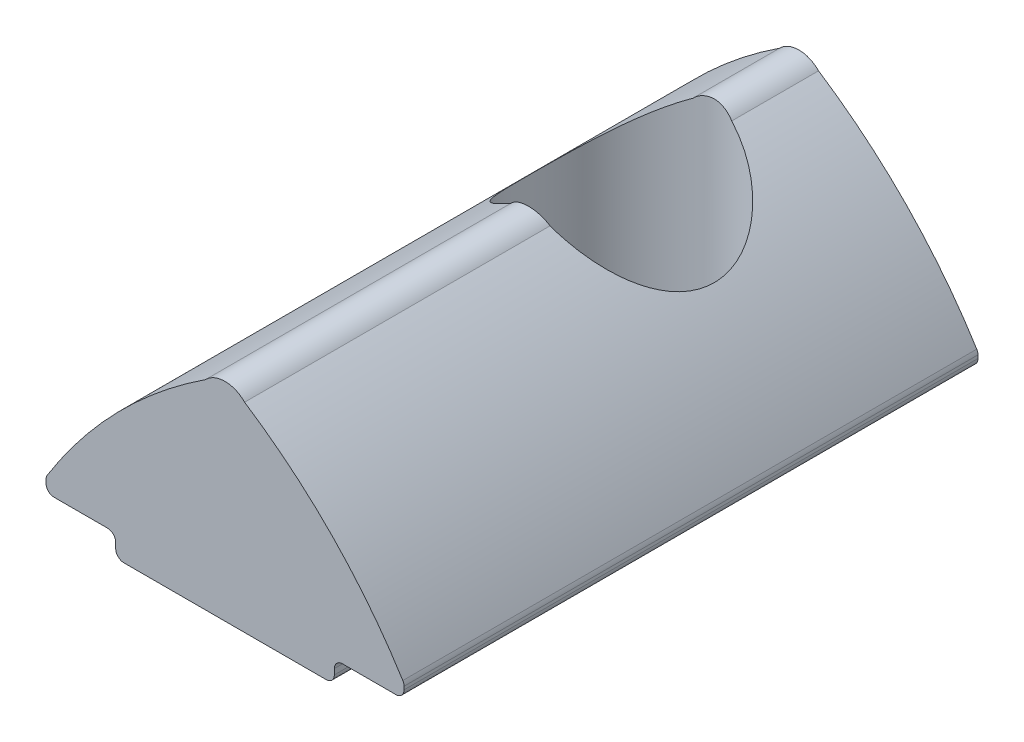
ISO-10303-21;
HEADER;
FILE_DESCRIPTION(('STEP AP214'),'2;1');
FILE_NAME('part.step','',(''),(''),'','','');
FILE_SCHEMA(('AUTOMOTIVE_DESIGN { 1 0 10303 214 1 1 1 1 }'));
ENDSEC;
DATA;
#1=APPLICATION_CONTEXT('core data for automotive mechanical design processes');
#2=APPLICATION_PROTOCOL_DEFINITION('international standard','automotive_design',2000,#1);
#3=PRODUCT_CONTEXT('',#1,'mechanical');
#4=PRODUCT('Part','Part','',(#3));
#5=PRODUCT_RELATED_PRODUCT_CATEGORY('part','',(#4));
#6=PRODUCT_DEFINITION_FORMATION('','',#4);
#7=PRODUCT_DEFINITION_CONTEXT('part definition',#1,'design');
#8=PRODUCT_DEFINITION('design','',#6,#7);
#9=PRODUCT_DEFINITION_SHAPE('','',#8);
#10=(LENGTH_UNIT() NAMED_UNIT(*) SI_UNIT(.MILLI.,.METRE.));
#11=(NAMED_UNIT(*) PLANE_ANGLE_UNIT() SI_UNIT($,.RADIAN.));
#12=(NAMED_UNIT(*) SI_UNIT($,.STERADIAN.) SOLID_ANGLE_UNIT());
#13=UNCERTAINTY_MEASURE_WITH_UNIT(LENGTH_MEASURE(1.E-05),#10,'distance_accuracy_value','');
#14=(GEOMETRIC_REPRESENTATION_CONTEXT(3) GLOBAL_UNCERTAINTY_ASSIGNED_CONTEXT((#13)) GLOBAL_UNIT_ASSIGNED_CONTEXT((#10,
#11,#12)) REPRESENTATION_CONTEXT('',''));
#15=CARTESIAN_POINT('',(0.,0.,0.));
#16=DIRECTION('',(0.,0.,1.));
#17=DIRECTION('',(1.,0.,0.));
#18=AXIS2_PLACEMENT_3D('',#15,#16,#17);
#19=CARTESIAN_POINT('',(-1.52655665885959E-13,6.59999999999986,10.5));
#20=DIRECTION('',(0.,0.,-1.));
#21=DIRECTION('',(-1.,0.,0.));
#22=AXIS2_PLACEMENT_3D('',#19,#20,#21);
#23=CYLINDRICAL_SURFACE('',#22,1.);
#24=DIRECTION('',(0.,0.,-1.));
#25=VECTOR('',#24,1.);
#26=CARTESIAN_POINT('',(0.716844819182674,7.29723274823443,10.5));
#27=LINE('',#26,#25);
#28=CARTESIAN_POINT('',(0.716844819182674,7.29723274823443,10.5));
#29=VERTEX_POINT('',#28);
#30=CARTESIAN_POINT('',(0.716844819182673,7.29723274823443,-0.676427598921525));
#31=VERTEX_POINT('',#30);
#32=EDGE_CURVE('E266',#29,#31,#27,.T.);
#33=ORIENTED_EDGE('',*,*,#32,.T.);
#34=CARTESIAN_POINT('',(0.716844819182678,7.29723274823444,-0.676427598921526));
#35=CARTESIAN_POINT('',(0.677925214604644,7.33729878800622,-0.668010463923414));
#36=CARTESIAN_POINT('',(0.63559102108074,7.37406183399302,-0.659615536711152));
#37=CARTESIAN_POINT('',(0.545253242979838,7.44012737215521,-0.643698211765947));
#38=CARTESIAN_POINT('',(0.497244743670531,7.46942332645217,-0.636176581771589));
#39=CARTESIAN_POINT('',(0.396725431604346,7.51965949452753,-0.622842974135057));
#40=CARTESIAN_POINT('',(0.344208888964102,7.54058887720242,-0.617033215168026));
#41=CARTESIAN_POINT('',(0.23624443626896,7.57332698927504,-0.607786052545363));
#42=CARTESIAN_POINT('',(0.180799011557425,7.58514332294269,-0.604346671213226));
#43=CARTESIAN_POINT('',(0.0701030157997564,7.59905686909638,-0.600283555889892));
#44=CARTESIAN_POINT('',(0.0148865582247654,7.60140446584473,-0.599587296575949));
#45=CARTESIAN_POINT('',(-0.0951534145605969,7.59698419297526,-0.600886452890884));
#46=CARTESIAN_POINT('',(-0.149976902734196,7.59021570209789,-0.602882051969392));
#47=CARTESIAN_POINT('',(-0.25660173105524,7.56802197984294,-0.609283631183055));
#48=CARTESIAN_POINT('',(-0.308440530318739,7.55276206895182,-0.613643540205256));
#49=CARTESIAN_POINT('',(-0.408830200514077,7.51419339352829,-0.624291486484262));
#50=CARTESIAN_POINT('',(-0.457380509340819,7.49088325709448,-0.630579852363889));
#51=CARTESIAN_POINT('',(-0.542858207527721,7.44104911351975,-0.643383161510443));
#52=CARTESIAN_POINT('',(-0.580426259307904,7.41556609575048,-0.649715485526811));
#53=CARTESIAN_POINT('',(-0.651676158522292,7.35984611066735,-0.662839292508831));
#54=CARTESIAN_POINT('',(-0.685363546175759,7.32961606997761,-0.669630098376307));
#55=CARTESIAN_POINT('',(-0.716844819182982,7.29723274823444,-0.676427598921477));
#56=B_SPLINE_CURVE_WITH_KNOTS('',3,(#34,#35,#36,#37,#38,#39,#40,#41,#42,#43,#44,#45,#46,#47,#48,
#49,#50,#51,#52,#53,#54,#55),.UNSPECIFIED.,.F.,.F.,(4,2,2,2,2,2,2,2,2,2,4),(0.,
0.169285541793144,0.338718797800577,0.508370691974889,0.677880868616981,0.842878039156925,
1.00788645479029,1.16978935126663,1.33171985249777,1.46881868726141,1.6057193018103),.UNSPECIFIED.);
#57=CARTESIAN_POINT('',(-0.71684481918298,7.29723274823442,-0.676427598921476));
#58=VERTEX_POINT('',#57);
#59=EDGE_CURVE('E11',#31,#58,#56,.T.);
#60=ORIENTED_EDGE('',*,*,#59,.T.);
#61=DIRECTION('',(0.,0.,-1.));
#62=VECTOR('',#61,1.);
#63=CARTESIAN_POINT('',(-0.716844819182982,7.29723274823444,10.5));
#64=LINE('',#63,#62);
#65=CARTESIAN_POINT('',(-0.716844819182982,7.29723274823444,10.5));
#66=VERTEX_POINT('',#65);
#67=EDGE_CURVE('E262',#66,#58,#64,.T.);
#68=ORIENTED_EDGE('',*,*,#67,.F.);
#69=CARTESIAN_POINT('',(-1.52655665885959E-13,6.59999999999986,10.5));
#70=DIRECTION('',(0.,0.,1.));
#71=DIRECTION('',(1.,0.,0.));
#72=AXIS2_PLACEMENT_3D('',#69,#70,#71);
#73=CIRCLE('',#72,1.);
#74=EDGE_CURVE('E381',#29,#66,#73,.T.);
#75=ORIENTED_EDGE('',*,*,#74,.F.);
#76=EDGE_LOOP('',(#33,#60,#68,#75));
#77=FACE_BOUND('',#76,.T.);
#78=ADVANCED_FACE('F37',(#77),#23,.T.);
#79=CARTESIAN_POINT('',(-3.70000000000043,0.299999999999793,10.5));
#80=DIRECTION('',(0.,0.,-1.));
#81=DIRECTION('',(-1.,0.,0.));
#82=AXIS2_PLACEMENT_3D('',#79,#80,#81);
#83=CYLINDRICAL_SURFACE('',#82,0.299999999999954);
#84=CARTESIAN_POINT('',(-3.70000000000043,0.299999999999793,-10.5));
#85=DIRECTION('',(0.,0.,1.));
#86=DIRECTION('',(1.,0.,0.));
#87=AXIS2_PLACEMENT_3D('',#84,#85,#86);
#88=CIRCLE('',#87,0.299999999999954);
#89=CARTESIAN_POINT('',(-4.00000000000038,0.299999999999793,-10.5));
#90=VERTEX_POINT('',#89);
#91=CARTESIAN_POINT('',(-3.70000000000043,-1.60461921527855E-13,-10.5));
#92=VERTEX_POINT('',#91);
#93=EDGE_CURVE('E211',#90,#92,#88,.T.);
#94=ORIENTED_EDGE('',*,*,#93,.T.);
#95=DIRECTION('',(0.,0.,-1.));
#96=VECTOR('',#95,1.);
#97=CARTESIAN_POINT('',(-3.70000000000043,-1.60461921527855E-13,10.5));
#98=LINE('',#97,#96);
#99=CARTESIAN_POINT('',(-3.70000000000043,-1.60461921527855E-13,10.5));
#100=VERTEX_POINT('',#99);
#101=EDGE_CURVE('E293',#100,#92,#98,.T.);
#102=ORIENTED_EDGE('',*,*,#101,.F.);
#103=CARTESIAN_POINT('',(-3.70000000000043,0.299999999999793,10.5));
#104=DIRECTION('',(0.,0.,1.));
#105=DIRECTION('',(1.,0.,0.));
#106=AXIS2_PLACEMENT_3D('',#103,#104,#105);
#107=CIRCLE('',#106,0.299999999999954);
#108=CARTESIAN_POINT('',(-4.00000000000038,0.299999999999793,10.5));
#109=VERTEX_POINT('',#108);
#110=EDGE_CURVE('E248',#109,#100,#107,.T.);
#111=ORIENTED_EDGE('',*,*,#110,.F.);
#112=DIRECTION('',(0.,0.,-1.));
#113=VECTOR('',#112,1.);
#114=CARTESIAN_POINT('',(-4.00000000000038,0.299999999999793,10.5));
#115=LINE('',#114,#113);
#116=EDGE_CURVE('E207',#109,#90,#115,.T.);
#117=ORIENTED_EDGE('',*,*,#116,.T.);
#118=EDGE_LOOP('',(#94,#102,#111,#117));
#119=FACE_BOUND('',#118,.T.);
#120=ADVANCED_FACE('F39',(#119),#83,.T.);
#121=CARTESIAN_POINT('',(-3.70000000000043,-1.60461921527855E-13,10.5));
#122=DIRECTION('',(0.,1.,0.));
#123=DIRECTION('',(0.,0.,1.));
#124=AXIS2_PLACEMENT_3D('',#121,#122,#123);
#125=PLANE('',#124);
#126=CARTESIAN_POINT('',(-2.67147415300428E-13,0.,-4.));
#127=DIRECTION('',(0.,-1.,0.));
#128=DIRECTION('',(0.,0.,-1.));
#129=AXIS2_PLACEMENT_3D('',#126,#127,#128);
#130=CIRCLE('',#129,3.39999999999999);
#131=CARTESIAN_POINT('',(-2.67147415300428E-13,0.,-7.39999999999999));
#132=VERTEX_POINT('',#131);
#133=EDGE_CURVE('E319',#132,#132,#130,.T.);
#134=ORIENTED_EDGE('',*,*,#133,.F.);
#135=EDGE_LOOP('',(#134));
#136=FACE_BOUND('',#135,.T.);
#137=DIRECTION('',(1.,0.,0.));
#138=VECTOR('',#137,1.);
#139=CARTESIAN_POINT('',(-3.70000000000043,-1.60461921527855E-13,-10.5));
#140=LINE('',#139,#138);
#141=CARTESIAN_POINT('',(3.69999999999989,-1.60461921527855E-13,-10.5));
#142=VERTEX_POINT('',#141);
#143=EDGE_CURVE('E214',#92,#142,#140,.T.);
#144=ORIENTED_EDGE('',*,*,#143,.T.);
#145=DIRECTION('',(0.,0.,-1.));
#146=VECTOR('',#145,1.);
#147=CARTESIAN_POINT('',(3.69999999999989,-1.60461921527855E-13,10.5));
#148=LINE('',#147,#146);
#149=CARTESIAN_POINT('',(3.69999999999989,-1.60461921527855E-13,10.5));
#150=VERTEX_POINT('',#149);
#151=EDGE_CURVE('E290',#150,#142,#148,.T.);
#152=ORIENTED_EDGE('',*,*,#151,.F.);
#153=DIRECTION('',(1.,0.,0.));
#154=VECTOR('',#153,1.);
#155=CARTESIAN_POINT('',(-3.70000000000043,-1.60461921527855E-13,10.5));
#156=LINE('',#155,#154);
#157=EDGE_CURVE('E138',#100,#150,#156,.T.);
#158=ORIENTED_EDGE('',*,*,#157,.F.);
#159=ORIENTED_EDGE('',*,*,#101,.T.);
#160=EDGE_LOOP('',(#144,#152,#158,#159));
#161=FACE_BOUND('',#160,.T.);
#162=ADVANCED_FACE('F358',(#136,#161),#125,.F.);
#163=CARTESIAN_POINT('',(3.69999999999989,0.299999999999793,10.5));
#164=DIRECTION('',(0.,0.,-1.));
#165=DIRECTION('',(-1.,0.,0.));
#166=AXIS2_PLACEMENT_3D('',#163,#164,#165);
#167=CYLINDRICAL_SURFACE('',#166,0.299999999999954);
#168=CARTESIAN_POINT('',(3.69999999999989,0.299999999999793,-10.5));
#169=DIRECTION('',(0.,0.,1.));
#170=DIRECTION('',(1.,0.,0.));
#171=AXIS2_PLACEMENT_3D('',#168,#169,#170);
#172=CIRCLE('',#171,0.299999999999954);
#173=CARTESIAN_POINT('',(3.99999999999985,0.299999999999793,-10.5));
#174=VERTEX_POINT('',#173);
#175=EDGE_CURVE('E216',#142,#174,#172,.T.);
#176=ORIENTED_EDGE('',*,*,#175,.T.);
#177=DIRECTION('',(0.,0.,-1.));
#178=VECTOR('',#177,1.);
#179=CARTESIAN_POINT('',(3.99999999999985,0.299999999999793,10.5));
#180=LINE('',#179,#178);
#181=CARTESIAN_POINT('',(3.99999999999985,0.299999999999793,10.5));
#182=VERTEX_POINT('',#181);
#183=EDGE_CURVE('E287',#182,#174,#180,.T.);
#184=ORIENTED_EDGE('',*,*,#183,.F.);
#185=CARTESIAN_POINT('',(3.69999999999989,0.299999999999793,10.5));
#186=DIRECTION('',(0.,0.,1.));
#187=DIRECTION('',(1.,0.,0.));
#188=AXIS2_PLACEMENT_3D('',#185,#186,#187);
#189=CIRCLE('',#188,0.299999999999954);
#190=EDGE_CURVE('E415',#150,#182,#189,.T.);
#191=ORIENTED_EDGE('',*,*,#190,.F.);
#192=ORIENTED_EDGE('',*,*,#151,.T.);
#193=EDGE_LOOP('',(#176,#184,#191,#192));
#194=FACE_BOUND('',#193,.T.);
#195=ADVANCED_FACE('F422',(#194),#167,.T.);
#196=CARTESIAN_POINT('',(3.99999999999985,0.299999999999793,10.5));
#197=DIRECTION('',(-1.,0.,0.));
#198=DIRECTION('',(0.,0.,1.));
#199=AXIS2_PLACEMENT_3D('',#196,#197,#198);
#200=PLANE('',#199);
#201=DIRECTION('',(0.,1.,0.));
#202=VECTOR('',#201,1.);
#203=CARTESIAN_POINT('',(3.99999999999985,0.299999999999793,-10.5));
#204=LINE('',#203,#202);
#205=CARTESIAN_POINT('',(3.99999999999985,0.499999999999839,-10.5));
#206=VERTEX_POINT('',#205);
#207=EDGE_CURVE('E218',#174,#206,#204,.T.);
#208=ORIENTED_EDGE('',*,*,#207,.T.);
#209=DIRECTION('',(0.,0.,-1.));
#210=VECTOR('',#209,1.);
#211=CARTESIAN_POINT('',(3.99999999999985,0.499999999999839,10.5));
#212=LINE('',#211,#210);
#213=CARTESIAN_POINT('',(3.99999999999985,0.499999999999839,10.5));
#214=VERTEX_POINT('',#213);
#215=EDGE_CURVE('E284',#214,#206,#212,.T.);
#216=ORIENTED_EDGE('',*,*,#215,.F.);
#217=DIRECTION('',(0.,1.,0.));
#218=VECTOR('',#217,1.);
#219=CARTESIAN_POINT('',(3.99999999999985,0.299999999999793,10.5));
#220=LINE('',#219,#218);
#221=EDGE_CURVE('E413',#182,#214,#220,.T.);
#222=ORIENTED_EDGE('',*,*,#221,.F.);
#223=ORIENTED_EDGE('',*,*,#183,.T.);
#224=EDGE_LOOP('',(#208,#216,#222,#223));
#225=FACE_BOUND('',#224,.T.);
#226=ADVANCED_FACE('F429',(#225),#200,.F.);
#227=CARTESIAN_POINT('',(4.2999999999998,0.499999999999839,10.5));
#228=DIRECTION('',(0.,0.,-1.));
#229=DIRECTION('',(-1.,0.,0.));
#230=AXIS2_PLACEMENT_3D('',#227,#228,#229);
#231=CYLINDRICAL_SURFACE('',#230,0.299999999999955);
#232=CARTESIAN_POINT('',(4.2999999999998,0.499999999999839,-10.5));
#233=DIRECTION('',(0.,0.,-1.));
#234=DIRECTION('',(1.,0.,0.));
#235=AXIS2_PLACEMENT_3D('',#232,#233,#234);
#236=CIRCLE('',#235,0.299999999999955);
#237=CARTESIAN_POINT('',(4.2999999999998,0.799999999999794,-10.5));
#238=VERTEX_POINT('',#237);
#239=EDGE_CURVE('E220',#206,#238,#236,.T.);
#240=ORIENTED_EDGE('',*,*,#239,.T.);
#241=DIRECTION('',(0.,0.,-1.));
#242=VECTOR('',#241,1.);
#243=CARTESIAN_POINT('',(4.2999999999998,0.799999999999794,10.5));
#244=LINE('',#243,#242);
#245=CARTESIAN_POINT('',(4.2999999999998,0.799999999999794,10.5));
#246=VERTEX_POINT('',#245);
#247=EDGE_CURVE('E281',#246,#238,#244,.T.);
#248=ORIENTED_EDGE('',*,*,#247,.F.);
#249=CARTESIAN_POINT('',(4.2999999999998,0.499999999999839,10.5));
#250=DIRECTION('',(0.,0.,-1.));
#251=DIRECTION('',(1.,0.,0.));
#252=AXIS2_PLACEMENT_3D('',#249,#250,#251);
#253=CIRCLE('',#252,0.299999999999955);
#254=EDGE_CURVE('E411',#214,#246,#253,.T.);
#255=ORIENTED_EDGE('',*,*,#254,.F.);
#256=ORIENTED_EDGE('',*,*,#215,.T.);
#257=EDGE_LOOP('',(#240,#248,#255,#256));
#258=FACE_BOUND('',#257,.T.);
#259=ADVANCED_FACE('F433',(#258),#231,.F.);
#260=CARTESIAN_POINT('',(4.2999999999998,0.799999999999794,10.5));
#261=DIRECTION('',(0.,1.,0.));
#262=DIRECTION('',(-1.,0.,0.));
#263=AXIS2_PLACEMENT_3D('',#260,#261,#262);
#264=PLANE('',#263);
#265=DIRECTION('',(1.,0.,0.));
#266=VECTOR('',#265,1.);
#267=CARTESIAN_POINT('',(4.2999999999998,0.799999999999794,-10.5));
#268=LINE('',#267,#266);
#269=CARTESIAN_POINT('',(6.24999999999985,0.799999999999749,-10.5));
#270=VERTEX_POINT('',#269);
#271=EDGE_CURVE('E222',#238,#270,#268,.T.);
#272=ORIENTED_EDGE('',*,*,#271,.T.);
#273=DIRECTION('',(0.,0.,-1.));
#274=VECTOR('',#273,1.);
#275=CARTESIAN_POINT('',(6.24999999999985,0.799999999999749,10.5));
#276=LINE('',#275,#274);
#277=CARTESIAN_POINT('',(6.24999999999985,0.799999999999749,10.5));
#278=VERTEX_POINT('',#277);
#279=EDGE_CURVE('E278',#278,#270,#276,.T.);
#280=ORIENTED_EDGE('',*,*,#279,.F.);
#281=DIRECTION('',(1.,0.,0.));
#282=VECTOR('',#281,1.);
#283=CARTESIAN_POINT('',(4.2999999999998,0.799999999999794,10.5));
#284=LINE('',#283,#282);
#285=EDGE_CURVE('E409',#246,#278,#284,.T.);
#286=ORIENTED_EDGE('',*,*,#285,.F.);
#287=ORIENTED_EDGE('',*,*,#247,.T.);
#288=EDGE_LOOP('',(#272,#280,#286,#287));
#289=FACE_BOUND('',#288,.T.);
#290=ADVANCED_FACE('F440',(#289),#264,.F.);
#291=CARTESIAN_POINT('',(6.24999999999985,1.09999999999975,10.5));
#292=DIRECTION('',(0.,0.,-1.));
#293=DIRECTION('',(-1.,0.,0.));
#294=AXIS2_PLACEMENT_3D('',#291,#292,#293);
#295=CYLINDRICAL_SURFACE('',#294,0.299999999999977);
#296=CARTESIAN_POINT('',(6.24999999999985,1.09999999999975,-10.5));
#297=DIRECTION('',(0.,0.,1.));
#298=DIRECTION('',(1.,0.,0.));
#299=AXIS2_PLACEMENT_3D('',#296,#297,#298);
#300=CIRCLE('',#299,0.299999999999977);
#301=CARTESIAN_POINT('',(6.54999999999982,1.09999999999975,-10.5));
#302=VERTEX_POINT('',#301);
#303=EDGE_CURVE('E224',#270,#302,#300,.T.);
#304=ORIENTED_EDGE('',*,*,#303,.T.);
#305=DIRECTION('',(0.,0.,-1.));
#306=VECTOR('',#305,1.);
#307=CARTESIAN_POINT('',(6.54999999999982,1.09999999999975,10.5));
#308=LINE('',#307,#306);
#309=CARTESIAN_POINT('',(6.54999999999982,1.09999999999975,10.5));
#310=VERTEX_POINT('',#309);
#311=EDGE_CURVE('E275',#310,#302,#308,.T.);
#312=ORIENTED_EDGE('',*,*,#311,.F.);
#313=CARTESIAN_POINT('',(6.24999999999985,1.09999999999975,10.5));
#314=DIRECTION('',(0.,0.,1.));
#315=DIRECTION('',(1.,0.,0.));
#316=AXIS2_PLACEMENT_3D('',#313,#314,#315);
#317=CIRCLE('',#316,0.299999999999977);
#318=EDGE_CURVE('E407',#278,#310,#317,.T.);
#319=ORIENTED_EDGE('',*,*,#318,.F.);
#320=ORIENTED_EDGE('',*,*,#279,.T.);
#321=EDGE_LOOP('',(#304,#312,#319,#320));
#322=FACE_BOUND('',#321,.T.);
#323=ADVANCED_FACE('F443',(#322),#295,.T.);
#324=CARTESIAN_POINT('',(6.5499999999998,1.09999999999975,10.5));
#325=DIRECTION('',(-1.,0.,0.));
#326=DIRECTION('',(0.,0.,1.));
#327=AXIS2_PLACEMENT_3D('',#324,#325,#326);
#328=PLANE('',#327);
#329=DIRECTION('',(0.,1.,0.));
#330=VECTOR('',#329,1.);
#331=CARTESIAN_POINT('',(6.5499999999998,1.09999999999975,-10.5));
#332=LINE('',#331,#330);
#333=CARTESIAN_POINT('',(6.5499999999998,1.21469473322208,-10.5));
#334=VERTEX_POINT('',#333);
#335=EDGE_CURVE('E226',#302,#334,#332,.T.);
#336=ORIENTED_EDGE('',*,*,#335,.T.);
#337=DIRECTION('',(0.,0.,-1.));
#338=VECTOR('',#337,1.);
#339=CARTESIAN_POINT('',(6.5499999999998,1.21469473322208,10.5));
#340=LINE('',#339,#338);
#341=CARTESIAN_POINT('',(6.5499999999998,1.21469473322208,10.5));
#342=VERTEX_POINT('',#341);
#343=EDGE_CURVE('E272',#342,#334,#340,.T.);
#344=ORIENTED_EDGE('',*,*,#343,.F.);
#345=DIRECTION('',(0.,1.,0.));
#346=VECTOR('',#345,1.);
#347=CARTESIAN_POINT('',(6.5499999999998,1.09999999999975,10.5));
#348=LINE('',#347,#346);
#349=EDGE_CURVE('E405',#310,#342,#348,.T.);
#350=ORIENTED_EDGE('',*,*,#349,.F.);
#351=ORIENTED_EDGE('',*,*,#311,.T.);
#352=EDGE_LOOP('',(#336,#344,#350,#351));
#353=FACE_BOUND('',#352,.T.);
#354=ADVANCED_FACE('F448',(#353),#328,.F.);
#355=CARTESIAN_POINT('',(6.24999999999985,1.21469473322208,10.5));
#356=DIRECTION('',(0.,0.,-1.));
#357=DIRECTION('',(-1.,0.,0.));
#358=AXIS2_PLACEMENT_3D('',#355,#356,#357);
#359=CYLINDRICAL_SURFACE('',#358,0.30000000000079);
#360=CARTESIAN_POINT('',(6.24999999999985,1.21469473322208,-10.5));
#361=DIRECTION('',(0.,0.,1.));
#362=DIRECTION('',(1.,0.,0.));
#363=AXIS2_PLACEMENT_3D('',#360,#361,#362);
#364=CIRCLE('',#363,0.30000000000079);
#365=CARTESIAN_POINT('',(6.50476031746962,1.37311563033851,-10.5));
#366=VERTEX_POINT('',#365);
#367=EDGE_CURVE('E228',#334,#366,#364,.T.);
#368=ORIENTED_EDGE('',*,*,#367,.T.);
#369=DIRECTION('',(0.,0.,-1.));
#370=VECTOR('',#369,1.);
#371=CARTESIAN_POINT('',(6.50476031746962,1.37311563033851,10.5));
#372=LINE('',#371,#370);
#373=CARTESIAN_POINT('',(6.50476031746962,1.37311563033851,10.5));
#374=VERTEX_POINT('',#373);
#375=EDGE_CURVE('E269',#374,#366,#372,.T.);
#376=ORIENTED_EDGE('',*,*,#375,.F.);
#377=CARTESIAN_POINT('',(6.24999999999985,1.21469473322208,10.5));
#378=DIRECTION('',(0.,0.,1.));
#379=DIRECTION('',(1.,0.,0.));
#380=AXIS2_PLACEMENT_3D('',#377,#378,#379);
#381=CIRCLE('',#380,0.30000000000079);
#382=EDGE_CURVE('E403',#342,#374,#381,.T.);
#383=ORIENTED_EDGE('',*,*,#382,.F.);
#384=ORIENTED_EDGE('',*,*,#343,.T.);
#385=EDGE_LOOP('',(#368,#376,#383,#384));
#386=FACE_BOUND('',#385,.T.);
#387=ADVANCED_FACE('F366',(#386),#359,.T.);
#388=CARTESIAN_POINT('',(-9.7960128561139,-8.76340459191186,10.5));
#389=DIRECTION('',(0.,0.,-1.));
#390=DIRECTION('',(-1.,0.,0.));
#391=AXIS2_PLACEMENT_3D('',#388,#389,#390);
#392=CYLINDRICAL_SURFACE('',#391,19.1954225864591);
#393=CARTESIAN_POINT('',(0.716844819182674,7.29723274823443,-7.32357240107847));
#394=VERTEX_POINT('',#393);
#395=CARTESIAN_POINT('',(0.716844819182674,7.29723274823443,-10.5));
#396=VERTEX_POINT('',#395);
#397=EDGE_CURVE('E265',#394,#396,#27,.T.);
#398=ORIENTED_EDGE('',*,*,#397,.F.);
#399=CARTESIAN_POINT('',(0.716844819182673,7.29723274823443,-7.32357240107847));
#400=CARTESIAN_POINT('',(0.835661872860583,7.21947619467974,-7.29792976608356));
#401=CARTESIAN_POINT('',(0.952641538621464,7.14100374687432,-7.26604617655781));
#402=CARTESIAN_POINT('',(1.18222238327077,6.98339968093494,-7.19014124982634));
#403=CARTESIAN_POINT('',(1.2948214903214,6.90426777187715,-7.14611424700351));
#404=CARTESIAN_POINT('',(1.51552024190477,6.74569207366581,-7.04597585691599));
#405=CARTESIAN_POINT('',(1.62358695236423,6.66624947414746,-6.98978985490219));
#406=CARTESIAN_POINT('',(1.83364144955107,6.50855168849648,-6.86576919450911));
#407=CARTESIAN_POINT('',(1.9356311253789,6.4302961390571,-6.7979381818028));
#408=CARTESIAN_POINT('',(2.18979997316073,6.23137539320205,-6.60815945508834));
#409=CARTESIAN_POINT('',(2.33694239107109,6.11232230335632,-6.47758391935885));
#410=CARTESIAN_POINT('',(2.60991554560769,5.88543764956056,-6.18809899318806));
#411=CARTESIAN_POINT('',(2.73580382860408,5.77757609994754,-6.02926858202703));
#412=CARTESIAN_POINT('',(2.93317888048356,5.60477877896568,-5.72642641487579));
#413=CARTESIAN_POINT('',(3.0104188212444,5.53582575238049,-5.58847445099719));
#414=CARTESIAN_POINT('',(3.14667330136627,5.41261614049534,-5.29773704701299));
#415=CARTESIAN_POINT('',(3.20571073543542,5.3583411041964,-5.14497056100201));
#416=CARTESIAN_POINT('',(3.29450332510778,5.27603059544326,-4.85199737841711));
#417=CARTESIAN_POINT('',(3.32738236940097,5.2452289395117,-4.71352528698482));
#418=CARTESIAN_POINT('',(3.37561318757847,5.19989154740688,-4.43096176856953));
#419=CARTESIAN_POINT('',(3.39097666068191,5.1853449540782,-4.28687415897598));
#420=CARTESIAN_POINT('',(3.4031018071807,5.17387281725529,-3.99684731123584));
#421=CARTESIAN_POINT('',(3.39981834948108,5.17699002535161,-3.85090443445255));
#422=CARTESIAN_POINT('',(3.37479453546419,5.20063345241674,-3.56205189569823));
#423=CARTESIAN_POINT('',(3.35304841982528,5.22116510372057,-3.41914319448124));
#424=CARTESIAN_POINT('',(3.2935081181849,5.27690391924387,-3.1444367012155));
#425=CARTESIAN_POINT('',(3.25621276592894,5.31165433787489,-3.01243452065067));
#426=CARTESIAN_POINT('',(3.16762320840483,5.39329047615233,-2.75724456007459));
#427=CARTESIAN_POINT('',(3.11632272386911,5.44018163867112,-2.63406076517336));
#428=CARTESIAN_POINT('',(2.97553368322178,5.56713561429123,-2.34387676806606));
#429=CARTESIAN_POINT('',(2.87929631068254,5.6525768764697,-2.18249249077104));
#430=CARTESIAN_POINT('',(2.66640148834311,5.8370205081618,-1.8823789786989));
#431=CARTESIAN_POINT('',(2.54969316308408,5.93605652752879,-1.74370789245872));
#432=CARTESIAN_POINT('',(2.2670851021093,6.1693637247354,-1.45620729766622));
#433=CARTESIAN_POINT('',(2.09629751083808,6.30608370320381,-1.31417717377661));
#434=CARTESIAN_POINT('',(1.73404699916373,6.5850223318817,-1.06724106685406));
#435=CARTESIAN_POINT('',(1.54259699438219,6.72723751187439,-0.96231206614217));
#436=CARTESIAN_POINT('',(1.24236578098332,6.94117566794499,-0.833210887037174));
#437=CARTESIAN_POINT('',(1.13955439750607,7.01295861291042,-0.794770166757637));
#438=CARTESIAN_POINT('',(0.930618276675482,7.15575482211975,-0.728009340859185));
#439=CARTESIAN_POINT('',(0.824503270093117,7.22676964467548,-0.699662099586746));
#440=CARTESIAN_POINT('',(0.716844819182674,7.29723274823443,-0.676427598921526));
#441=B_SPLINE_CURVE_WITH_KNOTS('',3,(#399,#400,#401,#402,#403,#404,#405,#406,#407,#408,#409,
#410,#411,#412,#413,#414,#415,#416,#417,#418,#419,#420,#421,#422,#423,#424,#425,#426,#427,#428,
#429,#430,#431,#432,#433,#434,#435,#436,#437,#438,#439,#440),.UNSPECIFIED.,.F.,.F.,(4,2,2,2,2,2,
2,2,2,2,2,2,2,2,2,2,2,2,2,2,4),(0.,0.432710020118783,0.865622267430869,1.30127051953041,
1.7367826322623,2.4238480343806,3.10902226364094,3.62463677200121,4.13960008105999,
4.57457918961178,5.00926759095435,5.44500851463465,5.88088541519316,6.30374077236503,
6.72678603099603,7.34262789550247,7.96002254680823,8.73860005462284,9.51669367891245,
9.90977049420035,10.301782424241),.UNSPECIFIED.);
#442=EDGE_CURVE('E57',#394,#31,#441,.T.);
#443=ORIENTED_EDGE('',*,*,#442,.T.);
#444=ORIENTED_EDGE('',*,*,#32,.F.);
#445=CARTESIAN_POINT('',(-9.7960128561139,-8.76340459191186,10.5));
#446=DIRECTION('',(0.,0.,1.));
#447=DIRECTION('',(1.,0.,0.));
#448=AXIS2_PLACEMENT_3D('',#445,#446,#447);
#449=CIRCLE('',#448,19.1954225864591);
#450=EDGE_CURVE('E383',#374,#29,#449,.T.);
#451=ORIENTED_EDGE('',*,*,#450,.F.);
#452=ORIENTED_EDGE('',*,*,#375,.T.);
#453=CARTESIAN_POINT('',(-9.7960128561139,-8.76340459191186,-10.5));
#454=DIRECTION('',(0.,0.,1.));
#455=DIRECTION('',(1.,0.,0.));
#456=AXIS2_PLACEMENT_3D('',#453,#454,#455);
#457=CIRCLE('',#456,19.1954225864591);
#458=EDGE_CURVE('E230',#366,#396,#457,.T.);
#459=ORIENTED_EDGE('',*,*,#458,.T.);
#460=EDGE_LOOP('',(#398,#443,#444,#451,#452,#459));
#461=FACE_BOUND('',#460,.T.);
#462=ADVANCED_FACE('F361',(#461),#392,.T.);
#463=CARTESIAN_POINT('',(-0.716844819182982,7.29723274823444,-7.32357240107852));
#464=VERTEX_POINT('',#463);
#465=CARTESIAN_POINT('',(-0.716844819182982,7.29723274823444,-10.5));
#466=VERTEX_POINT('',#465);
#467=EDGE_CURVE('E261',#464,#466,#64,.T.);
#468=ORIENTED_EDGE('',*,*,#467,.F.);
#469=CARTESIAN_POINT('',(-0.716844819182982,7.29723274823444,-7.32357240107852));
#470=CARTESIAN_POINT('',(-0.677966694803588,7.33725916068424,-7.33198124772598));
#471=CARTESIAN_POINT('',(-0.635675740687449,7.37398952502022,-7.34036796543182));
#472=CARTESIAN_POINT('',(-0.545345757708447,7.44006999304515,-7.35628701934098));
#473=CARTESIAN_POINT('',(-0.497290790106936,7.46939890211269,-7.36381686877506));
#474=CARTESIAN_POINT('',(-0.396667966241509,7.51968962780325,-7.37716509067683));
#475=CARTESIAN_POINT('',(-0.344093377291658,7.54063868943138,-7.38298085060875));
#476=CARTESIAN_POINT('',(-0.236099089718011,7.57335629109456,-7.39222223350622));
#477=CARTESIAN_POINT('',(-0.180689154414543,7.5851543369627,-7.39565553448537));
#478=CARTESIAN_POINT('',(-0.104033731871294,7.59479309799861,-7.39847168583561));
#479=CARTESIAN_POINT('',(-0.0832848021468527,7.59674356856342,-7.3990434250485));
#480=CARTESIAN_POINT('',(-0.0416938776176046,7.59934769428067,-7.39980797276931));
#481=CARTESIAN_POINT('',(-0.0208518626531686,7.60000105335661,-7.4000006947633));
#482=CARTESIAN_POINT('',(0.0548257116670725,7.59999723041356,-7.39999817326185));
#483=CARTESIAN_POINT('',(0.109719502330882,7.59547037968376,-7.39865921865021));
#484=CARTESIAN_POINT('',(0.217978851657931,7.57750043153436,-7.393440150114));
#485=CARTESIAN_POINT('',(0.271341012898937,7.56403890312769,-7.38955478350708));
#486=CARTESIAN_POINT('',(0.374879491823597,7.52868375634134,-7.37966962274293));
#487=CARTESIAN_POINT('',(0.425060854250474,7.5068039000134,-7.37367328090322));
#488=CARTESIAN_POINT('',(0.520993503263774,7.45529177352183,-7.36019493544526));
#489=CARTESIAN_POINT('',(0.566750177401368,7.42566909817215,-7.35271477330697));
#490=CARTESIAN_POINT('',(0.628725800519396,7.37799769536695,-7.34141879694317));
#491=CARTESIAN_POINT('',(0.647181094365496,7.3627128667779,-7.3378870523109));
#492=CARTESIAN_POINT('',(0.68290636810662,7.33089596696027,-7.33076103770866));
#493=CARTESIAN_POINT('',(0.700178529891608,7.31436631647747,-7.32716689904249));
#494=CARTESIAN_POINT('',(0.716844819182678,7.29723274823443,-7.32357240107847));
#495=B_SPLINE_CURVE_WITH_KNOTS('',3,(#469,#470,#471,#472,#473,#474,#475,#476,#477,#478,#479,
#480,#481,#482,#483,#484,#485,#486,#487,#488,#489,#490,#491,#492,#493,#494),.UNSPECIFIED.,.F.,
.F.,(4,2,2,2,2,2,2,2,2,2,2,2,4),(0.,0.169119928568776,0.338718785552822,0.508574816126028,
0.677880872635107,0.740391514066179,0.80291642243242,0.96731289171558,1.13204954627612,
1.29651803033878,1.46078366526314,1.533398808764,1.60587621678232),.UNSPECIFIED.);
#496=EDGE_CURVE('E50',#464,#394,#495,.T.);
#497=ORIENTED_EDGE('',*,*,#496,.T.);
#498=ORIENTED_EDGE('',*,*,#397,.T.);
#499=CARTESIAN_POINT('',(-1.52655665885959E-13,6.59999999999986,-10.5));
#500=DIRECTION('',(0.,0.,1.));
#501=DIRECTION('',(1.,0.,0.));
#502=AXIS2_PLACEMENT_3D('',#499,#500,#501);
#503=CIRCLE('',#502,1.);
#504=EDGE_CURVE('E233',#396,#466,#503,.T.);
#505=ORIENTED_EDGE('',*,*,#504,.T.);
#506=EDGE_LOOP('',(#468,#497,#498,#505));
#507=FACE_BOUND('',#506,.T.);
#508=ADVANCED_FACE('F297',(#507),#23,.T.);
#509=CARTESIAN_POINT('',(9.7960128561136,-8.76340459191186,10.5));
#510=DIRECTION('',(0.,0.,-1.));
#511=DIRECTION('',(-1.,0.,0.));
#512=AXIS2_PLACEMENT_3D('',#509,#510,#511);
#513=CYLINDRICAL_SURFACE('',#512,19.1954225864591);
#514=ORIENTED_EDGE('',*,*,#67,.T.);
#515=CARTESIAN_POINT('',(-0.71684481918298,7.29723274823442,-0.676427598921476));
#516=CARTESIAN_POINT('',(-0.835661872860891,7.21947619467973,-0.702070233916383));
#517=CARTESIAN_POINT('',(-0.952641538621773,7.14100374687431,-0.733953823442123));
#518=CARTESIAN_POINT('',(-1.18222238327108,6.98339968093493,-0.80985875017357));
#519=CARTESIAN_POINT('',(-1.29482149032172,6.90426777187713,-0.853885752996398));
#520=CARTESIAN_POINT('',(-1.51552024190509,6.7456920736658,-0.954024143083896));
#521=CARTESIAN_POINT('',(-1.62358695236456,6.66624947414744,-1.01021014509769));
#522=CARTESIAN_POINT('',(-1.83364144955139,6.50855168849646,-1.13423080549075));
#523=CARTESIAN_POINT('',(-1.93563112537923,6.43029613905707,-1.20206181819706));
#524=CARTESIAN_POINT('',(-2.18979997316108,6.231375393202,-1.3918405449115));
#525=CARTESIAN_POINT('',(-2.33694239107146,6.11232230335626,-1.52241608064099));
#526=CARTESIAN_POINT('',(-2.60991554560808,5.88543764956048,-1.81190100681177));
#527=CARTESIAN_POINT('',(-2.73580382860449,5.77757609994745,-1.97073141797281));
#528=CARTESIAN_POINT('',(-2.933178880484,5.60477877896556,-2.27357358512404));
#529=CARTESIAN_POINT('',(-3.01041882124484,5.53582575238036,-2.41152554900264));
#530=CARTESIAN_POINT('',(-3.14667330136674,5.41261614049519,-2.70226295298684));
#531=CARTESIAN_POINT('',(-3.20571073543589,5.35834110419624,-2.85502943899782));
#532=CARTESIAN_POINT('',(-3.29450332510827,5.27603059544309,-3.14800262158272));
#533=CARTESIAN_POINT('',(-3.32738236940146,5.24522893951151,-3.28647471301501));
#534=CARTESIAN_POINT('',(-3.37561318757899,5.19989154740668,-3.56903823143029));
#535=CARTESIAN_POINT('',(-3.39097666068243,5.185344954078,-3.71312584102385));
#536=CARTESIAN_POINT('',(-3.40310180718123,5.17387281725507,-4.00315268876398));
#537=CARTESIAN_POINT('',(-3.39981834948162,5.17699002535138,-4.14909556554728));
#538=CARTESIAN_POINT('',(-3.37479453546474,5.2006334524165,-4.4379481043016));
#539=CARTESIAN_POINT('',(-3.35304841982584,5.22116510372033,-4.58085680551859));
#540=CARTESIAN_POINT('',(-3.29350811818547,5.27690391924361,-4.85556329878434));
#541=CARTESIAN_POINT('',(-3.25621276592952,5.31165433787463,-4.98756547934917));
#542=CARTESIAN_POINT('',(-3.16762320840543,5.39329047615206,-5.24275543992525));
#543=CARTESIAN_POINT('',(-3.11632272386972,5.44018163867084,-5.36593923482648));
#544=CARTESIAN_POINT('',(-2.9755336832224,5.56713561429094,-5.65612323193378));
#545=CARTESIAN_POINT('',(-2.87929631068318,5.6525768764694,-5.8175075092288));
#546=CARTESIAN_POINT('',(-2.66640148834377,5.83702050816149,-6.11762102130094));
#547=CARTESIAN_POINT('',(-2.54969316308475,5.93605652752848,-6.25629210754112));
#548=CARTESIAN_POINT('',(-2.26708510210999,6.16936372473508,-6.54379270233363));
#549=CARTESIAN_POINT('',(-2.09629751083878,6.30608370320348,-6.68582282622325));
#550=CARTESIAN_POINT('',(-1.73404699916446,6.58502233188138,-6.93275893314582));
#551=CARTESIAN_POINT('',(-1.54259699438292,6.72723751187407,-7.03768793385772));
#552=CARTESIAN_POINT('',(-1.242365780984,6.94117566794472,-7.16678911296277));
#553=CARTESIAN_POINT('',(-1.13955439750668,7.01295861291021,-7.20522983324234));
#554=CARTESIAN_POINT('',(-0.930618276675939,7.15575482211964,-7.27199065914084));
#555=CARTESIAN_POINT('',(-0.8245032700935,7.22676964467542,-7.30033790041329));
#556=CARTESIAN_POINT('',(-0.716844819182982,7.29723274823443,-7.32357240107852));
#557=B_SPLINE_CURVE_WITH_KNOTS('',3,(#515,#516,#517,#518,#519,#520,#521,#522,#523,#524,#525,
#526,#527,#528,#529,#530,#531,#532,#533,#534,#535,#536,#537,#538,#539,#540,#541,#542,#543,#544,
#545,#546,#547,#548,#549,#550,#551,#552,#553,#554,#555,#556),.UNSPECIFIED.,.F.,.F.,(4,2,2,2,2,2,
2,2,2,2,2,2,2,2,2,2,2,2,2,2,4),(0.,0.432710020118784,0.865622267430868,1.30127051953041,
1.7367826322623,2.42384803438064,3.10902226364103,3.62463677200132,4.13960008106012,
4.57457918961191,5.00926759095449,5.44500851463479,5.88088541519331,6.30374077236516,
6.72678603099616,7.34262789550257,7.9600225468083,8.7386000546229,9.5166936789125,
9.90977049420069,10.3017824242416),.UNSPECIFIED.);
#558=EDGE_CURVE('E313',#58,#464,#557,.T.);
#559=ORIENTED_EDGE('',*,*,#558,.T.);
#560=ORIENTED_EDGE('',*,*,#467,.T.);
#561=CARTESIAN_POINT('',(9.7960128561136,-8.76340459191186,-10.5));
#562=DIRECTION('',(0.,0.,1.));
#563=DIRECTION('',(1.,0.,0.));
#564=AXIS2_PLACEMENT_3D('',#561,#562,#563);
#565=CIRCLE('',#564,19.1954225864591);
#566=CARTESIAN_POINT('',(-6.50476031747064,1.37311563033896,-10.5));
#567=VERTEX_POINT('',#566);
#568=EDGE_CURVE('E236',#466,#567,#565,.T.);
#569=ORIENTED_EDGE('',*,*,#568,.T.);
#570=DIRECTION('',(0.,0.,-1.));
#571=VECTOR('',#570,1.);
#572=CARTESIAN_POINT('',(-6.50476031747064,1.37311563033896,10.5));
#573=LINE('',#572,#571);
#574=CARTESIAN_POINT('',(-6.50476031747064,1.37311563033896,10.5));
#575=VERTEX_POINT('',#574);
#576=EDGE_CURVE('E258',#575,#567,#573,.T.);
#577=ORIENTED_EDGE('',*,*,#576,.F.);
#578=CARTESIAN_POINT('',(9.7960128561136,-8.76340459191186,10.5));
#579=DIRECTION('',(0.,0.,1.));
#580=DIRECTION('',(1.,0.,0.));
#581=AXIS2_PLACEMENT_3D('',#578,#579,#580);
#582=CIRCLE('',#581,19.1954225864591);
#583=EDGE_CURVE('E397',#66,#575,#582,.T.);
#584=ORIENTED_EDGE('',*,*,#583,.F.);
#585=EDGE_LOOP('',(#514,#559,#560,#569,#577,#584));
#586=FACE_BOUND('',#585,.T.);
#587=ADVANCED_FACE('F324',(#586),#513,.T.);
#588=CARTESIAN_POINT('',(-6.25000000000015,1.21469473322208,10.5));
#589=DIRECTION('',(0.,0.,-1.));
#590=DIRECTION('',(-1.,0.,0.));
#591=AXIS2_PLACEMENT_3D('',#588,#589,#590);
#592=CYLINDRICAL_SURFACE('',#591,0.300000000000789);
#593=CARTESIAN_POINT('',(-6.25000000000015,1.21469473322208,-10.5));
#594=DIRECTION('',(0.,0.,1.));
#595=DIRECTION('',(1.,0.,0.));
#596=AXIS2_PLACEMENT_3D('',#593,#594,#595);
#597=CIRCLE('',#596,0.300000000000789);
#598=CARTESIAN_POINT('',(-6.55000000000094,1.21469473322208,-10.5));
#599=VERTEX_POINT('',#598);
#600=EDGE_CURVE('E238',#567,#599,#597,.T.);
#601=ORIENTED_EDGE('',*,*,#600,.T.);
#602=DIRECTION('',(0.,0.,-1.));
#603=VECTOR('',#602,1.);
#604=CARTESIAN_POINT('',(-6.55000000000094,1.21469473322208,10.5));
#605=LINE('',#604,#603);
#606=CARTESIAN_POINT('',(-6.55000000000094,1.21469473322208,10.5));
#607=VERTEX_POINT('',#606);
#608=EDGE_CURVE('E255',#607,#599,#605,.T.);
#609=ORIENTED_EDGE('',*,*,#608,.F.);
#610=CARTESIAN_POINT('',(-6.25000000000015,1.21469473322208,10.5));
#611=DIRECTION('',(0.,0.,1.));
#612=DIRECTION('',(1.,0.,0.));
#613=AXIS2_PLACEMENT_3D('',#610,#611,#612);
#614=CIRCLE('',#613,0.300000000000789);
#615=EDGE_CURVE('E395',#575,#607,#614,.T.);
#616=ORIENTED_EDGE('',*,*,#615,.F.);
#617=ORIENTED_EDGE('',*,*,#576,.T.);
#618=EDGE_LOOP('',(#601,#609,#616,#617));
#619=FACE_BOUND('',#618,.T.);
#620=ADVANCED_FACE('F328',(#619),#592,.T.);
#621=CARTESIAN_POINT('',(-6.55000000000011,1.09999999999975,10.5));
#622=DIRECTION('',(1.,0.,0.));
#623=DIRECTION('',(0.,0.,-1.));
#624=AXIS2_PLACEMENT_3D('',#621,#622,#623);
#625=PLANE('',#624);
#626=DIRECTION('',(0.,-1.,0.));
#627=VECTOR('',#626,1.);
#628=CARTESIAN_POINT('',(-6.55000000000011,1.09999999999975,-10.5));
#629=LINE('',#628,#627);
#630=CARTESIAN_POINT('',(-6.55000000000011,1.09999999999975,-10.5));
#631=VERTEX_POINT('',#630);
#632=EDGE_CURVE('E240',#599,#631,#629,.T.);
#633=ORIENTED_EDGE('',*,*,#632,.T.);
#634=DIRECTION('',(0.,0.,-1.));
#635=VECTOR('',#634,1.);
#636=CARTESIAN_POINT('',(-6.55000000000011,1.09999999999975,10.5));
#637=LINE('',#636,#635);
#638=CARTESIAN_POINT('',(-6.55000000000011,1.09999999999975,10.5));
#639=VERTEX_POINT('',#638);
#640=EDGE_CURVE('E252',#639,#631,#637,.T.);
#641=ORIENTED_EDGE('',*,*,#640,.F.);
#642=DIRECTION('',(0.,-1.,0.));
#643=VECTOR('',#642,1.);
#644=CARTESIAN_POINT('',(-6.55000000000011,1.09999999999975,10.5));
#645=LINE('',#644,#643);
#646=EDGE_CURVE('E394',#607,#639,#645,.T.);
#647=ORIENTED_EDGE('',*,*,#646,.F.);
#648=ORIENTED_EDGE('',*,*,#608,.T.);
#649=EDGE_LOOP('',(#633,#641,#647,#648));
#650=FACE_BOUND('',#649,.T.);
#651=ADVANCED_FACE('F332',(#650),#625,.F.);
#652=CARTESIAN_POINT('',(-6.25000000000015,1.09999999999975,10.5));
#653=DIRECTION('',(0.,0.,-1.));
#654=DIRECTION('',(-1.,0.,0.));
#655=AXIS2_PLACEMENT_3D('',#652,#653,#654);
#656=CYLINDRICAL_SURFACE('',#655,0.299999999999977);
#657=CARTESIAN_POINT('',(-6.25000000000015,1.09999999999975,-10.5));
#658=DIRECTION('',(0.,0.,1.));
#659=DIRECTION('',(1.,0.,0.));
#660=AXIS2_PLACEMENT_3D('',#657,#658,#659);
#661=CIRCLE('',#660,0.299999999999977);
#662=CARTESIAN_POINT('',(-6.25000000000015,0.799999999999771,-10.5));
#663=VERTEX_POINT('',#662);
#664=EDGE_CURVE('E242',#631,#663,#661,.T.);
#665=ORIENTED_EDGE('',*,*,#664,.T.);
#666=DIRECTION('',(0.,0.,-1.));
#667=VECTOR('',#666,1.);
#668=CARTESIAN_POINT('',(-6.25000000000015,0.799999999999771,10.5));
#669=LINE('',#668,#667);
#670=CARTESIAN_POINT('',(-6.25000000000015,0.799999999999771,10.5));
#671=VERTEX_POINT('',#670);
#672=EDGE_CURVE('E202',#671,#663,#669,.T.);
#673=ORIENTED_EDGE('',*,*,#672,.F.);
#674=CARTESIAN_POINT('',(-6.25000000000015,1.09999999999975,10.5));
#675=DIRECTION('',(0.,0.,1.));
#676=DIRECTION('',(1.,0.,0.));
#677=AXIS2_PLACEMENT_3D('',#674,#675,#676);
#678=CIRCLE('',#677,0.299999999999977);
#679=EDGE_CURVE('E190',#639,#671,#678,.T.);
#680=ORIENTED_EDGE('',*,*,#679,.F.);
#681=ORIENTED_EDGE('',*,*,#640,.T.);
#682=EDGE_LOOP('',(#665,#673,#680,#681));
#683=FACE_BOUND('',#682,.T.);
#684=ADVANCED_FACE('F336',(#683),#656,.T.);
#685=CARTESIAN_POINT('',(-6.25000000000015,0.799999999999749,10.5));
#686=DIRECTION('',(0.,1.,0.));
#687=DIRECTION('',(-1.,0.,0.));
#688=AXIS2_PLACEMENT_3D('',#685,#686,#687);
#689=PLANE('',#688);
#690=DIRECTION('',(1.,0.,0.));
#691=VECTOR('',#690,1.);
#692=CARTESIAN_POINT('',(-6.25000000000015,0.799999999999749,-10.5));
#693=LINE('',#692,#691);
#694=CARTESIAN_POINT('',(-4.30000000000033,0.799999999999794,-10.5));
#695=VERTEX_POINT('',#694);
#696=EDGE_CURVE('E199',#663,#695,#693,.T.);
#697=ORIENTED_EDGE('',*,*,#696,.T.);
#698=DIRECTION('',(0.,0.,-1.));
#699=VECTOR('',#698,1.);
#700=CARTESIAN_POINT('',(-4.30000000000033,0.799999999999794,10.5));
#701=LINE('',#700,#699);
#702=CARTESIAN_POINT('',(-4.30000000000033,0.799999999999794,10.5));
#703=VERTEX_POINT('',#702);
#704=EDGE_CURVE('E196',#703,#695,#701,.T.);
#705=ORIENTED_EDGE('',*,*,#704,.F.);
#706=DIRECTION('',(1.,0.,0.));
#707=VECTOR('',#706,1.);
#708=CARTESIAN_POINT('',(-6.25000000000015,0.799999999999749,10.5));
#709=LINE('',#708,#707);
#710=EDGE_CURVE('E183',#671,#703,#709,.T.);
#711=ORIENTED_EDGE('',*,*,#710,.F.);
#712=ORIENTED_EDGE('',*,*,#672,.T.);
#713=EDGE_LOOP('',(#697,#705,#711,#712));
#714=FACE_BOUND('',#713,.T.);
#715=ADVANCED_FACE('F197',(#714),#689,.F.);
#716=CARTESIAN_POINT('',(-4.30000000000033,0.499999999999839,10.5));
#717=DIRECTION('',(0.,0.,-1.));
#718=DIRECTION('',(-1.,0.,0.));
#719=AXIS2_PLACEMENT_3D('',#716,#717,#718);
#720=CYLINDRICAL_SURFACE('',#719,0.299999999999955);
#721=CARTESIAN_POINT('',(-4.30000000000033,0.499999999999839,-10.5));
#722=DIRECTION('',(0.,0.,-1.));
#723=DIRECTION('',(1.,0.,0.));
#724=AXIS2_PLACEMENT_3D('',#721,#722,#723);
#725=CIRCLE('',#724,0.299999999999955);
#726=CARTESIAN_POINT('',(-4.00000000000038,0.499999999999726,-10.5));
#727=VERTEX_POINT('',#726);
#728=EDGE_CURVE('E245',#695,#727,#725,.T.);
#729=ORIENTED_EDGE('',*,*,#728,.T.);
#730=DIRECTION('',(0.,0.,-1.));
#731=VECTOR('',#730,1.);
#732=CARTESIAN_POINT('',(-4.00000000000038,0.499999999999726,10.5));
#733=LINE('',#732,#731);
#734=CARTESIAN_POINT('',(-4.00000000000038,0.499999999999726,10.5));
#735=VERTEX_POINT('',#734);
#736=EDGE_CURVE('E203',#735,#727,#733,.T.);
#737=ORIENTED_EDGE('',*,*,#736,.F.);
#738=CARTESIAN_POINT('',(-4.30000000000033,0.499999999999839,10.5));
#739=DIRECTION('',(0.,0.,-1.));
#740=DIRECTION('',(1.,0.,0.));
#741=AXIS2_PLACEMENT_3D('',#738,#739,#740);
#742=CIRCLE('',#741,0.299999999999955);
#743=EDGE_CURVE('E187',#703,#735,#742,.T.);
#744=ORIENTED_EDGE('',*,*,#743,.F.);
#745=ORIENTED_EDGE('',*,*,#704,.T.);
#746=EDGE_LOOP('',(#729,#737,#744,#745));
#747=FACE_BOUND('',#746,.T.);
#748=ADVANCED_FACE('F205',(#747),#720,.F.);
#749=CARTESIAN_POINT('',(-4.00000000000038,0.299999999999793,10.5));
#750=DIRECTION('',(1.,0.,0.));
#751=DIRECTION('',(0.,0.,-1.));
#752=AXIS2_PLACEMENT_3D('',#749,#750,#751);
#753=PLANE('',#752);
#754=DIRECTION('',(0.,-1.,0.));
#755=VECTOR('',#754,1.);
#756=CARTESIAN_POINT('',(-4.00000000000038,0.299999999999793,-10.5));
#757=LINE('',#756,#755);
#758=EDGE_CURVE('E129',#727,#90,#757,.T.);
#759=ORIENTED_EDGE('',*,*,#758,.T.);
#760=ORIENTED_EDGE('',*,*,#116,.F.);
#761=DIRECTION('',(0.,-1.,0.));
#762=VECTOR('',#761,1.);
#763=CARTESIAN_POINT('',(-4.00000000000038,0.299999999999793,10.5));
#764=LINE('',#763,#762);
#765=EDGE_CURVE('E66',#735,#109,#764,.T.);
#766=ORIENTED_EDGE('',*,*,#765,.F.);
#767=ORIENTED_EDGE('',*,*,#736,.T.);
#768=EDGE_LOOP('',(#759,#760,#766,#767));
#769=FACE_BOUND('',#768,.T.);
#770=ADVANCED_FACE('F345',(#769),#753,.F.);
#771=CARTESIAN_POINT('',(-3.70000000000043,0.299999999999793,10.5));
#772=DIRECTION('',(0.,0.,1.));
#773=DIRECTION('',(1.,0.,0.));
#774=AXIS2_PLACEMENT_3D('',#771,#772,#773);
#775=PLANE('',#774);
#776=ORIENTED_EDGE('',*,*,#110,.T.);
#777=ORIENTED_EDGE('',*,*,#157,.T.);
#778=ORIENTED_EDGE('',*,*,#190,.T.);
#779=ORIENTED_EDGE('',*,*,#221,.T.);
#780=ORIENTED_EDGE('',*,*,#254,.T.);
#781=ORIENTED_EDGE('',*,*,#285,.T.);
#782=ORIENTED_EDGE('',*,*,#318,.T.);
#783=ORIENTED_EDGE('',*,*,#349,.T.);
#784=ORIENTED_EDGE('',*,*,#382,.T.);
#785=ORIENTED_EDGE('',*,*,#450,.T.);
#786=ORIENTED_EDGE('',*,*,#74,.T.);
#787=ORIENTED_EDGE('',*,*,#583,.T.);
#788=ORIENTED_EDGE('',*,*,#615,.T.);
#789=ORIENTED_EDGE('',*,*,#646,.T.);
#790=ORIENTED_EDGE('',*,*,#679,.T.);
#791=ORIENTED_EDGE('',*,*,#710,.T.);
#792=ORIENTED_EDGE('',*,*,#743,.T.);
#793=ORIENTED_EDGE('',*,*,#765,.T.);
#794=EDGE_LOOP('',(#776,#777,#778,#779,#780,#781,#782,#783,#784,#785,#786,#787,#788,#789,#790,
#791,#792,#793));
#795=FACE_BOUND('',#794,.T.);
#796=ADVANCED_FACE('F185',(#795),#775,.T.);
#797=CARTESIAN_POINT('',(-3.70000000000043,0.299999999999793,-10.5));
#798=DIRECTION('',(0.,0.,1.));
#799=DIRECTION('',(1.,0.,0.));
#800=AXIS2_PLACEMENT_3D('',#797,#798,#799);
#801=PLANE('',#800);
#802=ORIENTED_EDGE('',*,*,#93,.F.);
#803=ORIENTED_EDGE('',*,*,#758,.F.);
#804=ORIENTED_EDGE('',*,*,#728,.F.);
#805=ORIENTED_EDGE('',*,*,#696,.F.);
#806=ORIENTED_EDGE('',*,*,#664,.F.);
#807=ORIENTED_EDGE('',*,*,#632,.F.);
#808=ORIENTED_EDGE('',*,*,#600,.F.);
#809=ORIENTED_EDGE('',*,*,#568,.F.);
#810=ORIENTED_EDGE('',*,*,#504,.F.);
#811=ORIENTED_EDGE('',*,*,#458,.F.);
#812=ORIENTED_EDGE('',*,*,#367,.F.);
#813=ORIENTED_EDGE('',*,*,#335,.F.);
#814=ORIENTED_EDGE('',*,*,#303,.F.);
#815=ORIENTED_EDGE('',*,*,#271,.F.);
#816=ORIENTED_EDGE('',*,*,#239,.F.);
#817=ORIENTED_EDGE('',*,*,#207,.F.);
#818=ORIENTED_EDGE('',*,*,#175,.F.);
#819=ORIENTED_EDGE('',*,*,#143,.F.);
#820=EDGE_LOOP('',(#802,#803,#804,#805,#806,#807,#808,#809,#810,#811,#812,#813,#814,#815,#816,
#817,#818,#819));
#821=FACE_BOUND('',#820,.T.);
#822=ADVANCED_FACE('F305',(#821),#801,.F.);
#823=CARTESIAN_POINT('',(-2.67147415300428E-13,0.,-4.));
#824=DIRECTION('',(0.,-1.,0.));
#825=DIRECTION('',(0.,0.,-1.));
#826=AXIS2_PLACEMENT_3D('',#823,#824,#825);
#827=CYLINDRICAL_SURFACE('',#826,3.39999999999999);
#828=ORIENTED_EDGE('',*,*,#133,.T.);
#829=EDGE_LOOP('',(#828));
#830=FACE_BOUND('',#829,.T.);
#831=ORIENTED_EDGE('',*,*,#442,.F.);
#832=ORIENTED_EDGE('',*,*,#496,.F.);
#833=ORIENTED_EDGE('',*,*,#558,.F.);
#834=ORIENTED_EDGE('',*,*,#59,.F.);
#835=EDGE_LOOP('',(#831,#832,#833,#834));
#836=FACE_BOUND('',#835,.T.);
#837=ADVANCED_FACE('F301',(#830,#836),#827,.F.);
#838=CLOSED_SHELL('',(#78,#120,#162,#195,#226,#259,#290,#323,#354,#387,#462,#508,#587,#620,#651,
#684,#715,#748,#770,#796,#822,#837));
#839=MANIFOLD_SOLID_BREP('B2',#838);
#840=ADVANCED_BREP_SHAPE_REPRESENTATION('',(#18,#839),#14);
#841=SHAPE_DEFINITION_REPRESENTATION(#9,#840);
ENDSEC;
END-ISO-10303-21;
